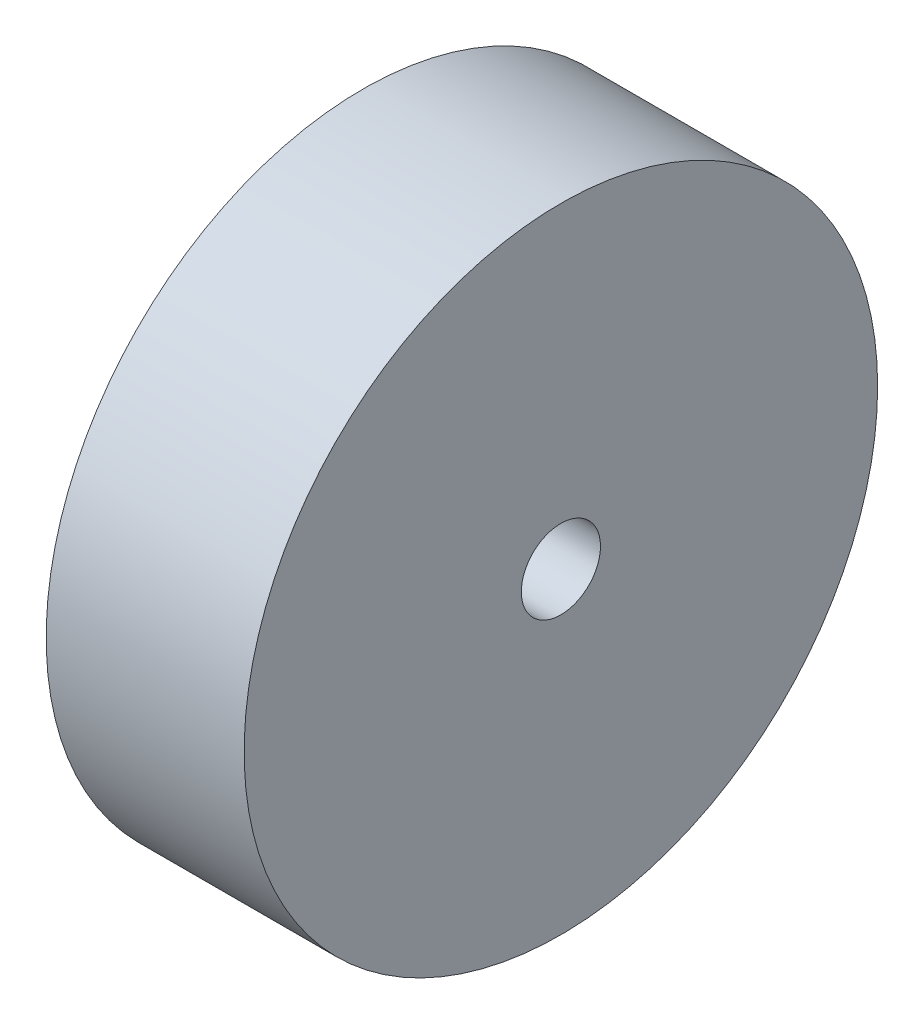
ISO-10303-21;
HEADER;
FILE_DESCRIPTION(('STEP AP214'),'2;1');
FILE_NAME('part.step','',(''),(''),'','','');
FILE_SCHEMA(('AUTOMOTIVE_DESIGN { 1 0 10303 214 1 1 1 1 }'));
ENDSEC;
DATA;
#1=APPLICATION_CONTEXT('core data for automotive mechanical design processes');
#2=APPLICATION_PROTOCOL_DEFINITION('international standard','automotive_design',2000,#1);
#3=PRODUCT_CONTEXT('',#1,'mechanical');
#4=PRODUCT('Part','Part','',(#3));
#5=PRODUCT_RELATED_PRODUCT_CATEGORY('part','',(#4));
#6=PRODUCT_DEFINITION_FORMATION('','',#4);
#7=PRODUCT_DEFINITION_CONTEXT('part definition',#1,'design');
#8=PRODUCT_DEFINITION('design','',#6,#7);
#9=PRODUCT_DEFINITION_SHAPE('','',#8);
#10=(LENGTH_UNIT() NAMED_UNIT(*) SI_UNIT(.MILLI.,.METRE.));
#11=(NAMED_UNIT(*) PLANE_ANGLE_UNIT() SI_UNIT($,.RADIAN.));
#12=(NAMED_UNIT(*) SI_UNIT($,.STERADIAN.) SOLID_ANGLE_UNIT());
#13=UNCERTAINTY_MEASURE_WITH_UNIT(LENGTH_MEASURE(1.E-05),#10,'distance_accuracy_value','');
#14=(GEOMETRIC_REPRESENTATION_CONTEXT(3) GLOBAL_UNCERTAINTY_ASSIGNED_CONTEXT((#13)) GLOBAL_UNIT_ASSIGNED_CONTEXT((#10,
#11,#12)) REPRESENTATION_CONTEXT('',''));
#15=CARTESIAN_POINT('',(0.,0.,0.));
#16=DIRECTION('',(0.,0.,1.));
#17=DIRECTION('',(1.,0.,0.));
#18=AXIS2_PLACEMENT_3D('',#15,#16,#17);
#19=CARTESIAN_POINT('',(0.,0.,0.));
#20=DIRECTION('',(1.,0.,0.));
#21=DIRECTION('',(0.,0.,-1.));
#22=AXIS2_PLACEMENT_3D('',#19,#20,#21);
#23=CYLINDRICAL_SURFACE('',#22,2.);
#24=CARTESIAN_POINT('',(0.,0.,0.));
#25=DIRECTION('',(1.,0.,0.));
#26=DIRECTION('',(0.,0.,-1.));
#27=AXIS2_PLACEMENT_3D('',#24,#25,#26);
#28=CIRCLE('',#27,2.);
#29=CARTESIAN_POINT('',(0.,0.,-2.));
#30=VERTEX_POINT('',#29);
#31=EDGE_CURVE('E61',#30,#30,#28,.T.);
#32=ORIENTED_EDGE('',*,*,#31,.T.);
#33=EDGE_LOOP('',(#32));
#34=FACE_BOUND('',#33,.T.);
#35=CARTESIAN_POINT('',(-8.,0.,0.));
#36=DIRECTION('',(1.,0.,0.));
#37=DIRECTION('',(0.,0.,-1.));
#38=AXIS2_PLACEMENT_3D('',#35,#36,#37);
#39=CIRCLE('',#38,2.);
#40=CARTESIAN_POINT('',(-8.,0.,-2.));
#41=VERTEX_POINT('',#40);
#42=EDGE_CURVE('E10',#41,#41,#39,.T.);
#43=ORIENTED_EDGE('',*,*,#42,.F.);
#44=EDGE_LOOP('',(#43));
#45=FACE_BOUND('',#44,.T.);
#46=ADVANCED_FACE('F33',(#34,#45),#23,.F.);
#47=CARTESIAN_POINT('',(-8.,0.,0.));
#48=DIRECTION('',(1.,0.,0.));
#49=DIRECTION('',(0.,0.,-1.));
#50=AXIS2_PLACEMENT_3D('',#47,#48,#49);
#51=PLANE('',#50);
#52=ORIENTED_EDGE('',*,*,#42,.T.);
#53=EDGE_LOOP('',(#52));
#54=FACE_BOUND('',#53,.T.);
#55=ADVANCED_FACE('F79',(#54),#51,.T.);
#56=CARTESIAN_POINT('',(-10.,5.,0.));
#57=DIRECTION('',(-1.,0.,0.));
#58=DIRECTION('',(0.,0.,1.));
#59=AXIS2_PLACEMENT_3D('',#56,#57,#58);
#60=PLANE('',#59);
#61=CARTESIAN_POINT('',(-10.,0.,0.));
#62=DIRECTION('',(1.,0.,0.));
#63=DIRECTION('',(0.,0.,-1.));
#64=AXIS2_PLACEMENT_3D('',#61,#62,#63);
#65=CIRCLE('',#64,5.);
#66=CARTESIAN_POINT('',(-10.,0.,-5.));
#67=VERTEX_POINT('',#66);
#68=EDGE_CURVE('E39',#67,#67,#65,.T.);
#69=ORIENTED_EDGE('',*,*,#68,.F.);
#70=EDGE_LOOP('',(#69));
#71=FACE_BOUND('',#70,.T.);
#72=ADVANCED_FACE('F83',(#71),#60,.T.);
#73=CARTESIAN_POINT('',(0.,0.,0.));
#74=DIRECTION('',(1.,0.,0.));
#75=DIRECTION('',(0.,0.,-1.));
#76=AXIS2_PLACEMENT_3D('',#73,#74,#75);
#77=CYLINDRICAL_SURFACE('',#76,5.);
#78=ORIENTED_EDGE('',*,*,#68,.T.);
#79=EDGE_LOOP('',(#78));
#80=FACE_BOUND('',#79,.T.);
#81=CARTESIAN_POINT('',(-2.,0.,0.));
#82=DIRECTION('',(1.,0.,0.));
#83=DIRECTION('',(0.,0.,-1.));
#84=AXIS2_PLACEMENT_3D('',#81,#82,#83);
#85=CIRCLE('',#84,5.);
#86=CARTESIAN_POINT('',(-2.,0.,-5.));
#87=VERTEX_POINT('',#86);
#88=EDGE_CURVE('E43',#87,#87,#85,.T.);
#89=ORIENTED_EDGE('',*,*,#88,.F.);
#90=EDGE_LOOP('',(#89));
#91=FACE_BOUND('',#90,.T.);
#92=ADVANCED_FACE('F87',(#80,#91),#77,.T.);
#93=CARTESIAN_POINT('',(-2.,10.,0.));
#94=DIRECTION('',(-1.,0.,0.));
#95=DIRECTION('',(0.,0.,1.));
#96=AXIS2_PLACEMENT_3D('',#93,#94,#95);
#97=PLANE('',#96);
#98=ORIENTED_EDGE('',*,*,#88,.T.);
#99=EDGE_LOOP('',(#98));
#100=FACE_BOUND('',#99,.T.);
#101=CARTESIAN_POINT('',(-2.,0.,0.));
#102=DIRECTION('',(1.,0.,0.));
#103=DIRECTION('',(0.,0.,-1.));
#104=AXIS2_PLACEMENT_3D('',#101,#102,#103);
#105=CIRCLE('',#104,10.);
#106=CARTESIAN_POINT('',(-2.,0.,-10.));
#107=VERTEX_POINT('',#106);
#108=EDGE_CURVE('E47',#107,#107,#105,.T.);
#109=ORIENTED_EDGE('',*,*,#108,.F.);
#110=EDGE_LOOP('',(#109));
#111=FACE_BOUND('',#110,.T.);
#112=ADVANCED_FACE('F93',(#100,#111),#97,.T.);
#113=CARTESIAN_POINT('',(0.,0.,0.));
#114=DIRECTION('',(1.,0.,0.));
#115=DIRECTION('',(0.,0.,-1.));
#116=AXIS2_PLACEMENT_3D('',#113,#114,#115);
#117=CYLINDRICAL_SURFACE('',#116,10.);
#118=ORIENTED_EDGE('',*,*,#108,.T.);
#119=EDGE_LOOP('',(#118));
#120=FACE_BOUND('',#119,.T.);
#121=CARTESIAN_POINT('',(-10.,0.,0.));
#122=DIRECTION('',(1.,0.,0.));
#123=DIRECTION('',(0.,0.,-1.));
#124=AXIS2_PLACEMENT_3D('',#121,#122,#123);
#125=CIRCLE('',#124,10.);
#126=CARTESIAN_POINT('',(-10.,0.,-10.));
#127=VERTEX_POINT('',#126);
#128=EDGE_CURVE('E52',#127,#127,#125,.T.);
#129=ORIENTED_EDGE('',*,*,#128,.F.);
#130=EDGE_LOOP('',(#129));
#131=FACE_BOUND('',#130,.T.);
#132=ADVANCED_FACE('F96',(#120,#131),#117,.F.);
#133=CARTESIAN_POINT('',(-10.,10.,0.));
#134=DIRECTION('',(-1.,0.,0.));
#135=DIRECTION('',(0.,0.,1.));
#136=AXIS2_PLACEMENT_3D('',#133,#134,#135);
#137=PLANE('',#136);
#138=ORIENTED_EDGE('',*,*,#128,.T.);
#139=EDGE_LOOP('',(#138));
#140=FACE_BOUND('',#139,.T.);
#141=CARTESIAN_POINT('',(-10.,0.,0.));
#142=DIRECTION('',(1.,0.,0.));
#143=DIRECTION('',(0.,0.,-1.));
#144=AXIS2_PLACEMENT_3D('',#141,#142,#143);
#145=CIRCLE('',#144,16.);
#146=CARTESIAN_POINT('',(-10.,0.,-16.));
#147=VERTEX_POINT('',#146);
#148=EDGE_CURVE('E55',#147,#147,#145,.T.);
#149=ORIENTED_EDGE('',*,*,#148,.F.);
#150=EDGE_LOOP('',(#149));
#151=FACE_BOUND('',#150,.T.);
#152=ADVANCED_FACE('F75',(#140,#151),#137,.T.);
#153=CARTESIAN_POINT('',(0.,0.,0.));
#154=DIRECTION('',(1.,0.,0.));
#155=DIRECTION('',(0.,0.,-1.));
#156=AXIS2_PLACEMENT_3D('',#153,#154,#155);
#157=CYLINDRICAL_SURFACE('',#156,16.);
#158=ORIENTED_EDGE('',*,*,#148,.T.);
#159=EDGE_LOOP('',(#158));
#160=FACE_BOUND('',#159,.T.);
#161=CARTESIAN_POINT('',(0.,0.,0.));
#162=DIRECTION('',(1.,0.,0.));
#163=DIRECTION('',(0.,0.,-1.));
#164=AXIS2_PLACEMENT_3D('',#161,#162,#163);
#165=CIRCLE('',#164,16.);
#166=CARTESIAN_POINT('',(0.,0.,-16.));
#167=VERTEX_POINT('',#166);
#168=EDGE_CURVE('E58',#167,#167,#165,.T.);
#169=ORIENTED_EDGE('',*,*,#168,.F.);
#170=EDGE_LOOP('',(#169));
#171=FACE_BOUND('',#170,.T.);
#172=ADVANCED_FACE('F69',(#160,#171),#157,.T.);
#173=CARTESIAN_POINT('',(0.,16.,0.));
#174=DIRECTION('',(1.,0.,0.));
#175=DIRECTION('',(0.,0.,-1.));
#176=AXIS2_PLACEMENT_3D('',#173,#174,#175);
#177=PLANE('',#176);
#178=ORIENTED_EDGE('',*,*,#168,.T.);
#179=EDGE_LOOP('',(#178));
#180=FACE_BOUND('',#179,.T.);
#181=ORIENTED_EDGE('',*,*,#31,.F.);
#182=EDGE_LOOP('',(#181));
#183=FACE_BOUND('',#182,.T.);
#184=ADVANCED_FACE('F67',(#180,#183),#177,.T.);
#185=CLOSED_SHELL('',(#46,#55,#72,#92,#112,#132,#152,#172,#184));
#186=MANIFOLD_SOLID_BREP('B2',#185);
#187=ADVANCED_BREP_SHAPE_REPRESENTATION('',(#18,#186),#14);
#188=SHAPE_DEFINITION_REPRESENTATION(#9,#187);
ENDSEC;
END-ISO-10303-21;
